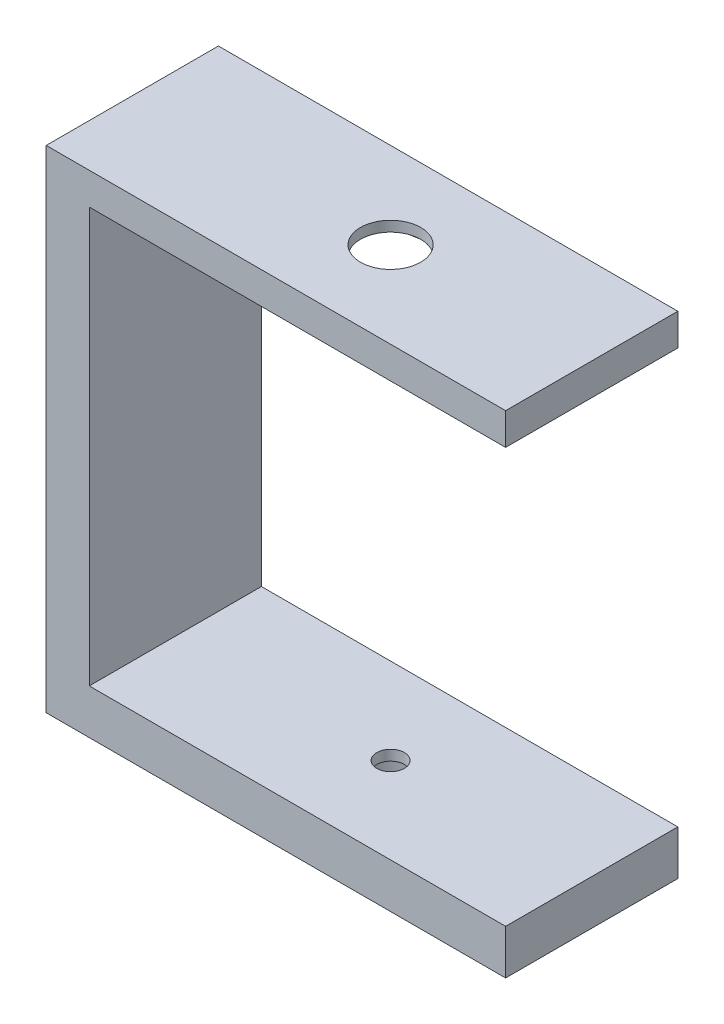
ISO-10303-21;
HEADER;
FILE_DESCRIPTION(('STEP AP214'),'2;1');
FILE_NAME('part.step','',(''),(''),'','','');
FILE_SCHEMA(('AUTOMOTIVE_DESIGN { 1 0 10303 214 1 1 1 1 }'));
ENDSEC;
DATA;
#1=APPLICATION_CONTEXT('core data for automotive mechanical design processes');
#2=APPLICATION_PROTOCOL_DEFINITION('international standard','automotive_design',2000,#1);
#3=PRODUCT_CONTEXT('',#1,'mechanical');
#4=PRODUCT('Part','Part','',(#3));
#5=PRODUCT_RELATED_PRODUCT_CATEGORY('part','',(#4));
#6=PRODUCT_DEFINITION_FORMATION('','',#4);
#7=PRODUCT_DEFINITION_CONTEXT('part definition',#1,'design');
#8=PRODUCT_DEFINITION('design','',#6,#7);
#9=PRODUCT_DEFINITION_SHAPE('','',#8);
#10=(LENGTH_UNIT() NAMED_UNIT(*) SI_UNIT(.MILLI.,.METRE.));
#11=(NAMED_UNIT(*) PLANE_ANGLE_UNIT() SI_UNIT($,.RADIAN.));
#12=(NAMED_UNIT(*) SI_UNIT($,.STERADIAN.) SOLID_ANGLE_UNIT());
#13=UNCERTAINTY_MEASURE_WITH_UNIT(LENGTH_MEASURE(1.E-05),#10,'distance_accuracy_value','');
#14=(GEOMETRIC_REPRESENTATION_CONTEXT(3) GLOBAL_UNCERTAINTY_ASSIGNED_CONTEXT((#13)) GLOBAL_UNIT_ASSIGNED_CONTEXT((#10,
#11,#12)) REPRESENTATION_CONTEXT('',''));
#15=CARTESIAN_POINT('',(0.,0.,0.));
#16=DIRECTION('',(0.,0.,1.));
#17=DIRECTION('',(1.,0.,0.));
#18=AXIS2_PLACEMENT_3D('',#15,#16,#17);
#19=CARTESIAN_POINT('',(0.,0.,0.));
#20=DIRECTION('',(0.,-1.,0.));
#21=DIRECTION('',(0.,0.,-1.));
#22=AXIS2_PLACEMENT_3D('',#19,#20,#21);
#23=PLANE('',#22);
#24=DIRECTION('',(0.,0.,1.));
#25=VECTOR('',#24,1.);
#26=CARTESIAN_POINT('',(5.,0.,0.));
#27=LINE('',#26,#25);
#28=CARTESIAN_POINT('',(5.,0.,-20.));
#29=VERTEX_POINT('',#28);
#30=CARTESIAN_POINT('',(5.,0.,0.));
#31=VERTEX_POINT('',#30);
#32=EDGE_CURVE('E59',#29,#31,#27,.T.);
#33=ORIENTED_EDGE('',*,*,#32,.F.);
#34=DIRECTION('',(-1.,0.,0.));
#35=VECTOR('',#34,1.);
#36=CARTESIAN_POINT('',(0.,0.,-20.));
#37=LINE('',#36,#35);
#38=CARTESIAN_POINT('',(53.36,0.,-20.));
#39=VERTEX_POINT('',#38);
#40=EDGE_CURVE('E249',#39,#29,#37,.T.);
#41=ORIENTED_EDGE('',*,*,#40,.F.);
#42=DIRECTION('',(0.,0.,-1.));
#43=VECTOR('',#42,1.);
#44=CARTESIAN_POINT('',(53.36,0.,0.));
#45=LINE('',#44,#43);
#46=CARTESIAN_POINT('',(53.36,0.,0.));
#47=VERTEX_POINT('',#46);
#48=EDGE_CURVE('E257',#47,#39,#45,.T.);
#49=ORIENTED_EDGE('',*,*,#48,.F.);
#50=DIRECTION('',(1.,0.,0.));
#51=VECTOR('',#50,1.);
#52=CARTESIAN_POINT('',(0.,0.,0.));
#53=LINE('',#52,#51);
#54=EDGE_CURVE('E244',#31,#47,#53,.T.);
#55=ORIENTED_EDGE('',*,*,#54,.F.);
#56=EDGE_LOOP('',(#33,#41,#49,#55));
#57=FACE_BOUND('',#56,.T.);
#58=CARTESIAN_POINT('',(30.,0.,-10.));
#59=DIRECTION('',(0.,-1.,0.));
#60=DIRECTION('',(0.,0.,-1.));
#61=AXIS2_PLACEMENT_3D('',#58,#59,#60);
#62=CIRCLE('',#61,6.34999999999999);
#63=CARTESIAN_POINT('',(31.1026659281849,0.,-3.74647076837246));
#64=VERTEX_POINT('',#63);
#65=CARTESIAN_POINT('',(28.897334071815,0.,-3.74647076837248));
#66=VERTEX_POINT('',#65);
#67=EDGE_CURVE('E51',#64,#66,#62,.T.);
#68=ORIENTED_EDGE('',*,*,#67,.F.);
#69=DIRECTION('',(0.984807753012212,0.,-0.17364817766691));
#70=VECTOR('',#69,1.);
#71=CARTESIAN_POINT('',(31.1026659281849,0.,-3.74647076837246));
#72=LINE('',#71,#70);
#73=CARTESIAN_POINT('',(46.1605720476516,0.,-6.40158589020922));
#74=VERTEX_POINT('',#73);
#75=EDGE_CURVE('E172',#64,#74,#72,.T.);
#76=ORIENTED_EDGE('',*,*,#75,.T.);
#77=CARTESIAN_POINT('',(45.5260745523336,0.,-9.99999999999979));
#78=DIRECTION('',(0.,1.,0.));
#79=DIRECTION('',(0.,0.,1.));
#80=AXIS2_PLACEMENT_3D('',#77,#78,#79);
#81=CIRCLE('',#80,3.65392544766649);
#82=CARTESIAN_POINT('',(46.1605720476517,0.,-13.5984141097903));
#83=VERTEX_POINT('',#82);
#84=EDGE_CURVE('E529',#74,#83,#81,.T.);
#85=ORIENTED_EDGE('',*,*,#84,.T.);
#86=DIRECTION('',(-0.984807753012207,0.,-0.173648177666937));
#87=VECTOR('',#86,1.);
#88=CARTESIAN_POINT('',(31.1026659281851,0.,-16.2535292316275));
#89=LINE('',#88,#87);
#90=CARTESIAN_POINT('',(31.1026659281851,0.,-16.2535292316275));
#91=VERTEX_POINT('',#90);
#92=EDGE_CURVE('E524',#83,#91,#89,.T.);
#93=ORIENTED_EDGE('',*,*,#92,.T.);
#94=CARTESIAN_POINT('',(30.,0.,-10.));
#95=DIRECTION('',(0.,-1.,0.));
#96=DIRECTION('',(0.,0.,-1.));
#97=AXIS2_PLACEMENT_3D('',#94,#95,#96);
#98=CIRCLE('',#97,6.34999999999999);
#99=CARTESIAN_POINT('',(28.897334071815,0.,-16.2535292316275));
#100=VERTEX_POINT('',#99);
#101=EDGE_CURVE('E176',#100,#91,#98,.T.);
#102=ORIENTED_EDGE('',*,*,#101,.F.);
#103=DIRECTION('',(0.984807753012209,0.,-0.173648177666923));
#104=VECTOR('',#103,1.);
#105=CARTESIAN_POINT('',(28.897334071815,0.,-16.2535292316275));
#106=LINE('',#105,#104);
#107=CARTESIAN_POINT('',(13.8394279523484,0.,-13.5984141097906));
#108=VERTEX_POINT('',#107);
#109=EDGE_CURVE('E200',#108,#100,#106,.T.);
#110=ORIENTED_EDGE('',*,*,#109,.F.);
#111=CARTESIAN_POINT('',(14.4739254476665,0.,-10.));
#112=DIRECTION('',(0.,-1.,0.));
#113=DIRECTION('',(0.,0.,1.));
#114=AXIS2_PLACEMENT_3D('',#111,#112,#113);
#115=CIRCLE('',#114,3.65392544766649);
#116=CARTESIAN_POINT('',(13.8394279523484,0.,-6.40158589020944));
#117=VERTEX_POINT('',#116);
#118=EDGE_CURVE('E197',#117,#108,#115,.T.);
#119=ORIENTED_EDGE('',*,*,#118,.F.);
#120=DIRECTION('',(-0.984807753012209,0.,-0.173648177666923));
#121=VECTOR('',#120,1.);
#122=CARTESIAN_POINT('',(28.897334071815,0.,-3.74647076837248));
#123=LINE('',#122,#121);
#124=EDGE_CURVE('E193',#66,#117,#123,.T.);
#125=ORIENTED_EDGE('',*,*,#124,.F.);
#126=EDGE_LOOP('',(#68,#76,#85,#93,#102,#110,#119,#125));
#127=FACE_BOUND('',#126,.T.);
#128=ADVANCED_FACE('F36',(#57,#127),#23,.T.);
#129=CARTESIAN_POINT('',(0.,3.7,0.));
#130=DIRECTION('',(1.,0.,0.));
#131=DIRECTION('',(0.,0.,-1.));
#132=AXIS2_PLACEMENT_3D('',#129,#130,#131);
#133=PLANE('',#132);
#134=DIRECTION('',(0.,-1.,0.));
#135=VECTOR('',#134,1.);
#136=CARTESIAN_POINT('',(0.,3.7,-20.));
#137=LINE('',#136,#135);
#138=CARTESIAN_POINT('',(0.,3.7,-20.));
#139=VERTEX_POINT('',#138);
#140=CARTESIAN_POINT('',(0.,-53.37,-20.));
#141=VERTEX_POINT('',#140);
#142=EDGE_CURVE('E255',#139,#141,#137,.T.);
#143=ORIENTED_EDGE('',*,*,#142,.T.);
#144=DIRECTION('',(0.,0.,-1.));
#145=VECTOR('',#144,1.);
#146=CARTESIAN_POINT('',(0.,-53.37,0.));
#147=LINE('',#146,#145);
#148=CARTESIAN_POINT('',(0.,-53.37,0.));
#149=VERTEX_POINT('',#148);
#150=EDGE_CURVE('E215',#149,#141,#147,.T.);
#151=ORIENTED_EDGE('',*,*,#150,.F.);
#152=DIRECTION('',(0.,-1.,0.));
#153=VECTOR('',#152,1.);
#154=CARTESIAN_POINT('',(0.,3.7,0.));
#155=LINE('',#154,#153);
#156=CARTESIAN_POINT('',(0.,3.7,0.));
#157=VERTEX_POINT('',#156);
#158=EDGE_CURVE('E11',#157,#149,#155,.T.);
#159=ORIENTED_EDGE('',*,*,#158,.F.);
#160=DIRECTION('',(0.,0.,1.));
#161=VECTOR('',#160,1.);
#162=CARTESIAN_POINT('',(0.,3.7,0.));
#163=LINE('',#162,#161);
#164=EDGE_CURVE('E245',#139,#157,#163,.T.);
#165=ORIENTED_EDGE('',*,*,#164,.F.);
#166=EDGE_LOOP('',(#143,#151,#159,#165));
#167=FACE_BOUND('',#166,.T.);
#168=ADVANCED_FACE('F38',(#167),#133,.F.);
#169=CARTESIAN_POINT('',(0.,3.7,0.));
#170=DIRECTION('',(0.,0.,-1.));
#171=DIRECTION('',(-1.,0.,0.));
#172=AXIS2_PLACEMENT_3D('',#169,#170,#171);
#173=PLANE('',#172);
#174=ORIENTED_EDGE('',*,*,#158,.T.);
#175=DIRECTION('',(-1.,0.,0.));
#176=VECTOR('',#175,1.);
#177=CARTESIAN_POINT('',(0.,-53.37,0.));
#178=LINE('',#177,#176);
#179=CARTESIAN_POINT('',(53.36,-53.37,0.));
#180=VERTEX_POINT('',#179);
#181=EDGE_CURVE('E212',#180,#149,#178,.T.);
#182=ORIENTED_EDGE('',*,*,#181,.F.);
#183=DIRECTION('',(0.,1.,0.));
#184=VECTOR('',#183,1.);
#185=CARTESIAN_POINT('',(53.36,-53.37,0.));
#186=LINE('',#185,#184);
#187=CARTESIAN_POINT('',(53.36,-48.17,0.));
#188=VERTEX_POINT('',#187);
#189=EDGE_CURVE('E223',#180,#188,#186,.T.);
#190=ORIENTED_EDGE('',*,*,#189,.T.);
#191=DIRECTION('',(-1.,0.,0.));
#192=VECTOR('',#191,1.);
#193=CARTESIAN_POINT('',(0.,-48.17,0.));
#194=LINE('',#193,#192);
#195=CARTESIAN_POINT('',(5.,-48.17,0.));
#196=VERTEX_POINT('',#195);
#197=EDGE_CURVE('E206',#188,#196,#194,.T.);
#198=ORIENTED_EDGE('',*,*,#197,.T.);
#199=DIRECTION('',(0.,1.,0.));
#200=VECTOR('',#199,1.);
#201=CARTESIAN_POINT('',(5.,-48.17,0.));
#202=LINE('',#201,#200);
#203=EDGE_CURVE('E237',#196,#31,#202,.T.);
#204=ORIENTED_EDGE('',*,*,#203,.T.);
#205=ORIENTED_EDGE('',*,*,#54,.T.);
#206=DIRECTION('',(0.,-1.,0.));
#207=VECTOR('',#206,1.);
#208=CARTESIAN_POINT('',(53.36,3.7,0.));
#209=LINE('',#208,#207);
#210=CARTESIAN_POINT('',(53.36,3.7,0.));
#211=VERTEX_POINT('',#210);
#212=EDGE_CURVE('E44',#211,#47,#209,.T.);
#213=ORIENTED_EDGE('',*,*,#212,.F.);
#214=DIRECTION('',(1.,0.,0.));
#215=VECTOR('',#214,1.);
#216=CARTESIAN_POINT('',(0.,3.7,0.));
#217=LINE('',#216,#215);
#218=EDGE_CURVE('E248',#157,#211,#217,.T.);
#219=ORIENTED_EDGE('',*,*,#218,.F.);
#220=EDGE_LOOP('',(#174,#182,#190,#198,#204,#205,#213,#219));
#221=FACE_BOUND('',#220,.T.);
#222=ADVANCED_FACE('F283',(#221),#173,.F.);
#223=CARTESIAN_POINT('',(53.36,3.7,0.));
#224=DIRECTION('',(-1.,0.,0.));
#225=DIRECTION('',(0.,0.,1.));
#226=AXIS2_PLACEMENT_3D('',#223,#224,#225);
#227=PLANE('',#226);
#228=ORIENTED_EDGE('',*,*,#48,.T.);
#229=DIRECTION('',(0.,-1.,0.));
#230=VECTOR('',#229,1.);
#231=CARTESIAN_POINT('',(53.36,3.7,-20.));
#232=LINE('',#231,#230);
#233=CARTESIAN_POINT('',(53.36,3.7,-20.));
#234=VERTEX_POINT('',#233);
#235=EDGE_CURVE('E261',#234,#39,#232,.T.);
#236=ORIENTED_EDGE('',*,*,#235,.F.);
#237=DIRECTION('',(0.,0.,-1.));
#238=VECTOR('',#237,1.);
#239=CARTESIAN_POINT('',(53.36,3.7,0.));
#240=LINE('',#239,#238);
#241=EDGE_CURVE('E251',#211,#234,#240,.T.);
#242=ORIENTED_EDGE('',*,*,#241,.F.);
#243=ORIENTED_EDGE('',*,*,#212,.T.);
#244=EDGE_LOOP('',(#228,#236,#242,#243));
#245=FACE_BOUND('',#244,.T.);
#246=ADVANCED_FACE('F268',(#245),#227,.F.);
#247=CARTESIAN_POINT('',(0.,3.7,-20.));
#248=DIRECTION('',(0.,0.,1.));
#249=DIRECTION('',(1.,0.,0.));
#250=AXIS2_PLACEMENT_3D('',#247,#248,#249);
#251=PLANE('',#250);
#252=ORIENTED_EDGE('',*,*,#40,.T.);
#253=DIRECTION('',(0.,1.,0.));
#254=VECTOR('',#253,1.);
#255=CARTESIAN_POINT('',(5.,-48.17,-20.));
#256=LINE('',#255,#254);
#257=CARTESIAN_POINT('',(5.,-48.17,-20.));
#258=VERTEX_POINT('',#257);
#259=EDGE_CURVE('E241',#258,#29,#256,.T.);
#260=ORIENTED_EDGE('',*,*,#259,.F.);
#261=DIRECTION('',(1.,0.,0.));
#262=VECTOR('',#261,1.);
#263=CARTESIAN_POINT('',(53.36,-48.17,-20.));
#264=LINE('',#263,#262);
#265=CARTESIAN_POINT('',(53.36,-48.17,-20.));
#266=VERTEX_POINT('',#265);
#267=EDGE_CURVE('E226',#258,#266,#264,.T.);
#268=ORIENTED_EDGE('',*,*,#267,.T.);
#269=DIRECTION('',(0.,1.,0.));
#270=VECTOR('',#269,1.);
#271=CARTESIAN_POINT('',(53.36,-53.37,-20.));
#272=LINE('',#271,#270);
#273=CARTESIAN_POINT('',(53.36,-53.37,-20.));
#274=VERTEX_POINT('',#273);
#275=EDGE_CURVE('E231',#274,#266,#272,.T.);
#276=ORIENTED_EDGE('',*,*,#275,.F.);
#277=DIRECTION('',(1.,0.,0.));
#278=VECTOR('',#277,1.);
#279=CARTESIAN_POINT('',(53.36,-53.37,-20.));
#280=LINE('',#279,#278);
#281=EDGE_CURVE('E219',#141,#274,#280,.T.);
#282=ORIENTED_EDGE('',*,*,#281,.F.);
#283=ORIENTED_EDGE('',*,*,#142,.F.);
#284=DIRECTION('',(-1.,0.,0.));
#285=VECTOR('',#284,1.);
#286=CARTESIAN_POINT('',(0.,3.7,-20.));
#287=LINE('',#286,#285);
#288=EDGE_CURVE('E253',#234,#139,#287,.T.);
#289=ORIENTED_EDGE('',*,*,#288,.F.);
#290=ORIENTED_EDGE('',*,*,#235,.T.);
#291=EDGE_LOOP('',(#252,#260,#268,#276,#282,#283,#289,#290));
#292=FACE_BOUND('',#291,.T.);
#293=ADVANCED_FACE('F274',(#292),#251,.F.);
#294=CARTESIAN_POINT('',(0.,3.7,0.));
#295=DIRECTION('',(0.,-1.,0.));
#296=DIRECTION('',(0.,0.,-1.));
#297=AXIS2_PLACEMENT_3D('',#294,#295,#296);
#298=PLANE('',#297);
#299=CARTESIAN_POINT('',(30.,3.7,-10.));
#300=DIRECTION('',(0.,-1.,0.));
#301=DIRECTION('',(0.,0.,-1.));
#302=AXIS2_PLACEMENT_3D('',#299,#300,#301);
#303=CIRCLE('',#302,3.5);
#304=CARTESIAN_POINT('',(30.,3.7,-13.5));
#305=VERTEX_POINT('',#304);
#306=EDGE_CURVE('E522',#305,#305,#303,.T.);
#307=ORIENTED_EDGE('',*,*,#306,.T.);
#308=EDGE_LOOP('',(#307));
#309=FACE_BOUND('',#308,.T.);
#310=ORIENTED_EDGE('',*,*,#164,.T.);
#311=ORIENTED_EDGE('',*,*,#218,.T.);
#312=ORIENTED_EDGE('',*,*,#241,.T.);
#313=ORIENTED_EDGE('',*,*,#288,.T.);
#314=EDGE_LOOP('',(#310,#311,#312,#313));
#315=FACE_BOUND('',#314,.T.);
#316=ADVANCED_FACE('F299',(#309,#315),#298,.F.);
#317=CARTESIAN_POINT('',(5.,-48.17,0.));
#318=DIRECTION('',(-1.,0.,0.));
#319=DIRECTION('',(0.,0.,1.));
#320=AXIS2_PLACEMENT_3D('',#317,#318,#319);
#321=PLANE('',#320);
#322=ORIENTED_EDGE('',*,*,#32,.T.);
#323=ORIENTED_EDGE('',*,*,#203,.F.);
#324=DIRECTION('',(0.,0.,1.));
#325=VECTOR('',#324,1.);
#326=CARTESIAN_POINT('',(5.,-48.17,0.));
#327=LINE('',#326,#325);
#328=EDGE_CURVE('E234',#258,#196,#327,.T.);
#329=ORIENTED_EDGE('',*,*,#328,.F.);
#330=ORIENTED_EDGE('',*,*,#259,.T.);
#331=EDGE_LOOP('',(#322,#323,#329,#330));
#332=FACE_BOUND('',#331,.T.);
#333=ADVANCED_FACE('F278',(#332),#321,.F.);
#334=CARTESIAN_POINT('',(53.36,-53.37,0.));
#335=DIRECTION('',(-1.,0.,0.));
#336=DIRECTION('',(0.,0.,1.));
#337=AXIS2_PLACEMENT_3D('',#334,#335,#336);
#338=PLANE('',#337);
#339=DIRECTION('',(0.,0.,1.));
#340=VECTOR('',#339,1.);
#341=CARTESIAN_POINT('',(53.36,-48.17,0.));
#342=LINE('',#341,#340);
#343=EDGE_CURVE('E216',#266,#188,#342,.T.);
#344=ORIENTED_EDGE('',*,*,#343,.T.);
#345=ORIENTED_EDGE('',*,*,#189,.F.);
#346=DIRECTION('',(0.,0.,1.));
#347=VECTOR('',#346,1.);
#348=CARTESIAN_POINT('',(53.36,-53.37,0.));
#349=LINE('',#348,#347);
#350=EDGE_CURVE('E221',#274,#180,#349,.T.);
#351=ORIENTED_EDGE('',*,*,#350,.F.);
#352=ORIENTED_EDGE('',*,*,#275,.T.);
#353=EDGE_LOOP('',(#344,#345,#351,#352));
#354=FACE_BOUND('',#353,.T.);
#355=ADVANCED_FACE('F288',(#354),#338,.F.);
#356=CARTESIAN_POINT('',(0.,-53.37,0.));
#357=DIRECTION('',(0.,1.,0.));
#358=DIRECTION('',(0.,0.,1.));
#359=AXIS2_PLACEMENT_3D('',#356,#357,#358);
#360=PLANE('',#359);
#361=CARTESIAN_POINT('',(30.,-53.37,-10.));
#362=DIRECTION('',(0.,-1.,0.));
#363=DIRECTION('',(0.,0.,-1.));
#364=AXIS2_PLACEMENT_3D('',#361,#362,#363);
#365=CIRCLE('',#364,5.);
#366=CARTESIAN_POINT('',(30.,-53.37,-15.));
#367=VERTEX_POINT('',#366);
#368=EDGE_CURVE('E513',#367,#367,#365,.T.);
#369=ORIENTED_EDGE('',*,*,#368,.F.);
#370=EDGE_LOOP('',(#369));
#371=FACE_BOUND('',#370,.T.);
#372=ORIENTED_EDGE('',*,*,#181,.T.);
#373=ORIENTED_EDGE('',*,*,#150,.T.);
#374=ORIENTED_EDGE('',*,*,#281,.T.);
#375=ORIENTED_EDGE('',*,*,#350,.T.);
#376=EDGE_LOOP('',(#372,#373,#374,#375));
#377=FACE_BOUND('',#376,.T.);
#378=ADVANCED_FACE('F294',(#371,#377),#360,.F.);
#379=CARTESIAN_POINT('',(0.,-48.17,0.));
#380=DIRECTION('',(0.,1.,0.));
#381=DIRECTION('',(0.,0.,1.));
#382=AXIS2_PLACEMENT_3D('',#379,#380,#381);
#383=PLANE('',#382);
#384=CARTESIAN_POINT('',(30.,-48.17,-10.));
#385=DIRECTION('',(0.,1.,0.));
#386=DIRECTION('',(0.,0.,1.));
#387=AXIS2_PLACEMENT_3D('',#384,#385,#386);
#388=CIRCLE('',#387,1.6);
#389=CARTESIAN_POINT('',(30.,-48.17,-11.6));
#390=VERTEX_POINT('',#389);
#391=EDGE_CURVE('E508',#390,#390,#388,.T.);
#392=ORIENTED_EDGE('',*,*,#391,.F.);
#393=EDGE_LOOP('',(#392));
#394=FACE_BOUND('',#393,.T.);
#395=ORIENTED_EDGE('',*,*,#267,.F.);
#396=ORIENTED_EDGE('',*,*,#328,.T.);
#397=ORIENTED_EDGE('',*,*,#197,.F.);
#398=ORIENTED_EDGE('',*,*,#343,.F.);
#399=EDGE_LOOP('',(#395,#396,#397,#398));
#400=FACE_BOUND('',#399,.T.);
#401=ADVANCED_FACE('F281',(#394,#400),#383,.T.);
#402=CARTESIAN_POINT('',(30.,2.5,-10.));
#403=DIRECTION('',(0.,-1.,0.));
#404=DIRECTION('',(0.,0.,-1.));
#405=AXIS2_PLACEMENT_3D('',#402,#403,#404);
#406=CYLINDRICAL_SURFACE('',#405,6.34999999999999);
#407=ORIENTED_EDGE('',*,*,#67,.T.);
#408=DIRECTION('',(0.,-1.,0.));
#409=VECTOR('',#408,1.);
#410=CARTESIAN_POINT('',(28.897334071815,2.5,-3.74647076837248));
#411=LINE('',#410,#409);
#412=CARTESIAN_POINT('',(28.897334071815,2.5,-3.74647076837248));
#413=VERTEX_POINT('',#412);
#414=EDGE_CURVE('E161',#413,#66,#411,.T.);
#415=ORIENTED_EDGE('',*,*,#414,.F.);
#416=CARTESIAN_POINT('',(30.,2.5,-10.));
#417=DIRECTION('',(0.,-1.,0.));
#418=DIRECTION('',(0.,0.,-1.));
#419=AXIS2_PLACEMENT_3D('',#416,#417,#418);
#420=CIRCLE('',#419,6.34999999999999);
#421=CARTESIAN_POINT('',(31.1026659281849,2.5,-3.74647076837246));
#422=VERTEX_POINT('',#421);
#423=EDGE_CURVE('E184',#422,#413,#420,.T.);
#424=ORIENTED_EDGE('',*,*,#423,.F.);
#425=DIRECTION('',(0.,-1.,0.));
#426=VECTOR('',#425,1.);
#427=CARTESIAN_POINT('',(31.1026659281849,2.5,-3.74647076837246));
#428=LINE('',#427,#426);
#429=EDGE_CURVE('E194',#422,#64,#428,.T.);
#430=ORIENTED_EDGE('',*,*,#429,.T.);
#431=EDGE_LOOP('',(#407,#415,#424,#430));
#432=FACE_BOUND('',#431,.T.);
#433=ADVANCED_FACE('F392',(#432),#406,.F.);
#434=CARTESIAN_POINT('',(30.,2.5,-10.));
#435=DIRECTION('',(0.,-1.,0.));
#436=DIRECTION('',(0.,0.,-1.));
#437=AXIS2_PLACEMENT_3D('',#434,#435,#436);
#438=CYLINDRICAL_SURFACE('',#437,6.34999999999999);
#439=ORIENTED_EDGE('',*,*,#101,.T.);
#440=DIRECTION('',(0.,-1.,0.));
#441=VECTOR('',#440,1.);
#442=CARTESIAN_POINT('',(31.1026659281851,2.5,-16.2535292316275));
#443=LINE('',#442,#441);
#444=CARTESIAN_POINT('',(31.1026659281851,2.5,-16.2535292316275));
#445=VERTEX_POINT('',#444);
#446=EDGE_CURVE('E168',#445,#91,#443,.T.);
#447=ORIENTED_EDGE('',*,*,#446,.F.);
#448=CARTESIAN_POINT('',(30.,2.5,-10.));
#449=DIRECTION('',(0.,-1.,0.));
#450=DIRECTION('',(0.,0.,-1.));
#451=AXIS2_PLACEMENT_3D('',#448,#449,#450);
#452=CIRCLE('',#451,6.34999999999999);
#453=CARTESIAN_POINT('',(28.897334071815,2.5,-16.2535292316275));
#454=VERTEX_POINT('',#453);
#455=EDGE_CURVE('E150',#454,#445,#452,.T.);
#456=ORIENTED_EDGE('',*,*,#455,.F.);
#457=DIRECTION('',(0.,-1.,0.));
#458=VECTOR('',#457,1.);
#459=CARTESIAN_POINT('',(28.897334071815,2.5,-16.2535292316275));
#460=LINE('',#459,#458);
#461=EDGE_CURVE('E204',#454,#100,#460,.T.);
#462=ORIENTED_EDGE('',*,*,#461,.T.);
#463=EDGE_LOOP('',(#439,#447,#456,#462));
#464=FACE_BOUND('',#463,.T.);
#465=ADVANCED_FACE('F174',(#464),#438,.F.);
#466=CARTESIAN_POINT('',(28.897334071815,2.5,-16.2535292316275));
#467=DIRECTION('',(-0.173648177666923,0.,-0.984807753012209));
#468=DIRECTION('',(-0.984807753012209,0.,0.173648177666923));
#469=AXIS2_PLACEMENT_3D('',#466,#467,#468);
#470=PLANE('',#469);
#471=ORIENTED_EDGE('',*,*,#109,.T.);
#472=ORIENTED_EDGE('',*,*,#461,.F.);
#473=DIRECTION('',(0.984807753012209,0.,-0.173648177666923));
#474=VECTOR('',#473,1.);
#475=CARTESIAN_POINT('',(28.897334071815,2.5,-16.2535292316275));
#476=LINE('',#475,#474);
#477=CARTESIAN_POINT('',(13.8394279523484,2.5,-13.5984141097906));
#478=VERTEX_POINT('',#477);
#479=EDGE_CURVE('E158',#478,#454,#476,.T.);
#480=ORIENTED_EDGE('',*,*,#479,.F.);
#481=DIRECTION('',(0.,-1.,0.));
#482=VECTOR('',#481,1.);
#483=CARTESIAN_POINT('',(13.8394279523484,2.5,-13.5984141097906));
#484=LINE('',#483,#482);
#485=EDGE_CURVE('E207',#478,#108,#484,.T.);
#486=ORIENTED_EDGE('',*,*,#485,.T.);
#487=EDGE_LOOP('',(#471,#472,#480,#486));
#488=FACE_BOUND('',#487,.T.);
#489=ADVANCED_FACE('F353',(#488),#470,.F.);
#490=CARTESIAN_POINT('',(14.4739254476665,2.5,-10.));
#491=DIRECTION('',(0.,-1.,0.));
#492=DIRECTION('',(0.,0.,-1.));
#493=AXIS2_PLACEMENT_3D('',#490,#491,#492);
#494=CYLINDRICAL_SURFACE('',#493,3.65392544766649);
#495=ORIENTED_EDGE('',*,*,#118,.T.);
#496=ORIENTED_EDGE('',*,*,#485,.F.);
#497=CARTESIAN_POINT('',(14.4739254476665,2.5,-10.));
#498=DIRECTION('',(0.,-1.,0.));
#499=DIRECTION('',(0.,0.,1.));
#500=AXIS2_PLACEMENT_3D('',#497,#498,#499);
#501=CIRCLE('',#500,3.65392544766649);
#502=CARTESIAN_POINT('',(13.8394279523484,2.5,-6.40158589020944));
#503=VERTEX_POINT('',#502);
#504=EDGE_CURVE('E189',#503,#478,#501,.T.);
#505=ORIENTED_EDGE('',*,*,#504,.F.);
#506=DIRECTION('',(0.,-1.,0.));
#507=VECTOR('',#506,1.);
#508=CARTESIAN_POINT('',(13.8394279523484,2.5,-6.40158589020944));
#509=LINE('',#508,#507);
#510=EDGE_CURVE('E209',#503,#117,#509,.T.);
#511=ORIENTED_EDGE('',*,*,#510,.T.);
#512=EDGE_LOOP('',(#495,#496,#505,#511));
#513=FACE_BOUND('',#512,.T.);
#514=ADVANCED_FACE('F358',(#513),#494,.F.);
#515=CARTESIAN_POINT('',(28.897334071815,2.5,-3.74647076837248));
#516=DIRECTION('',(-0.173648177666923,0.,0.984807753012209));
#517=DIRECTION('',(0.984807753012209,0.,0.173648177666923));
#518=AXIS2_PLACEMENT_3D('',#515,#516,#517);
#519=PLANE('',#518);
#520=ORIENTED_EDGE('',*,*,#124,.T.);
#521=ORIENTED_EDGE('',*,*,#510,.F.);
#522=DIRECTION('',(-0.984807753012209,0.,-0.173648177666923));
#523=VECTOR('',#522,1.);
#524=CARTESIAN_POINT('',(28.897334071815,2.5,-3.74647076837248));
#525=LINE('',#524,#523);
#526=EDGE_CURVE('E186',#413,#503,#525,.T.);
#527=ORIENTED_EDGE('',*,*,#526,.F.);
#528=ORIENTED_EDGE('',*,*,#414,.T.);
#529=EDGE_LOOP('',(#520,#521,#527,#528));
#530=FACE_BOUND('',#529,.T.);
#531=ADVANCED_FACE('F370',(#530),#519,.F.);
#532=CARTESIAN_POINT('',(30.,2.5,-10.));
#533=DIRECTION('',(0.,-1.,0.));
#534=DIRECTION('',(0.,0.,-1.));
#535=AXIS2_PLACEMENT_3D('',#532,#533,#534);
#536=PLANE('',#535);
#537=CARTESIAN_POINT('',(30.,2.5,-10.));
#538=DIRECTION('',(0.,-1.,0.));
#539=DIRECTION('',(0.,0.,-1.));
#540=AXIS2_PLACEMENT_3D('',#537,#538,#539);
#541=CIRCLE('',#540,3.5);
#542=CARTESIAN_POINT('',(30.,2.5,-13.5));
#543=VERTEX_POINT('',#542);
#544=EDGE_CURVE('E519',#543,#543,#541,.T.);
#545=ORIENTED_EDGE('',*,*,#544,.F.);
#546=EDGE_LOOP('',(#545));
#547=FACE_BOUND('',#546,.T.);
#548=ORIENTED_EDGE('',*,*,#423,.T.);
#549=ORIENTED_EDGE('',*,*,#526,.T.);
#550=ORIENTED_EDGE('',*,*,#504,.T.);
#551=ORIENTED_EDGE('',*,*,#479,.T.);
#552=ORIENTED_EDGE('',*,*,#455,.T.);
#553=DIRECTION('',(-0.984807753012207,0.,-0.173648177666937));
#554=VECTOR('',#553,1.);
#555=CARTESIAN_POINT('',(31.1026659281851,2.5,-16.2535292316275));
#556=LINE('',#555,#554);
#557=CARTESIAN_POINT('',(46.1605720476517,2.5,-13.5984141097903));
#558=VERTEX_POINT('',#557);
#559=EDGE_CURVE('E155',#558,#445,#556,.T.);
#560=ORIENTED_EDGE('',*,*,#559,.F.);
#561=CARTESIAN_POINT('',(45.5260745523336,2.5,-9.99999999999979));
#562=DIRECTION('',(0.,1.,0.));
#563=DIRECTION('',(0.,0.,1.));
#564=AXIS2_PLACEMENT_3D('',#561,#562,#563);
#565=CIRCLE('',#564,3.65392544766649);
#566=CARTESIAN_POINT('',(46.1605720476516,2.5,-6.40158589020922));
#567=VERTEX_POINT('',#566);
#568=EDGE_CURVE('E171',#567,#558,#565,.T.);
#569=ORIENTED_EDGE('',*,*,#568,.F.);
#570=DIRECTION('',(0.984807753012212,0.,-0.17364817766691));
#571=VECTOR('',#570,1.);
#572=CARTESIAN_POINT('',(31.1026659281849,2.5,-3.74647076837246));
#573=LINE('',#572,#571);
#574=EDGE_CURVE('E177',#422,#567,#573,.T.);
#575=ORIENTED_EDGE('',*,*,#574,.F.);
#576=EDGE_LOOP('',(#548,#549,#550,#551,#552,#560,#569,#575));
#577=FACE_BOUND('',#576,.T.);
#578=ADVANCED_FACE('F153',(#547,#577),#536,.T.);
#579=CARTESIAN_POINT('',(31.1026659281849,2.5,-3.74647076837246));
#580=DIRECTION('',(-0.17364817766691,0.,-0.984807753012212));
#581=DIRECTION('',(-0.984807753012212,0.,0.17364817766691));
#582=AXIS2_PLACEMENT_3D('',#579,#580,#581);
#583=PLANE('',#582);
#584=ORIENTED_EDGE('',*,*,#75,.F.);
#585=ORIENTED_EDGE('',*,*,#429,.F.);
#586=ORIENTED_EDGE('',*,*,#574,.T.);
#587=DIRECTION('',(0.,-1.,0.));
#588=VECTOR('',#587,1.);
#589=CARTESIAN_POINT('',(46.1605720476516,2.5,-6.40158589020922));
#590=LINE('',#589,#588);
#591=EDGE_CURVE('E179',#567,#74,#590,.T.);
#592=ORIENTED_EDGE('',*,*,#591,.T.);
#593=EDGE_LOOP('',(#584,#585,#586,#592));
#594=FACE_BOUND('',#593,.T.);
#595=ADVANCED_FACE('F410',(#594),#583,.T.);
#596=CARTESIAN_POINT('',(45.5260745523336,2.5,-9.99999999999979));
#597=DIRECTION('',(0.,-1.,0.));
#598=DIRECTION('',(0.,0.,-1.));
#599=AXIS2_PLACEMENT_3D('',#596,#597,#598);
#600=CYLINDRICAL_SURFACE('',#599,3.65392544766649);
#601=ORIENTED_EDGE('',*,*,#84,.F.);
#602=ORIENTED_EDGE('',*,*,#591,.F.);
#603=ORIENTED_EDGE('',*,*,#568,.T.);
#604=DIRECTION('',(0.,-1.,0.));
#605=VECTOR('',#604,1.);
#606=CARTESIAN_POINT('',(46.1605720476517,2.5,-13.5984141097903));
#607=LINE('',#606,#605);
#608=EDGE_CURVE('E170',#558,#83,#607,.T.);
#609=ORIENTED_EDGE('',*,*,#608,.T.);
#610=EDGE_LOOP('',(#601,#602,#603,#609));
#611=FACE_BOUND('',#610,.T.);
#612=ADVANCED_FACE('F415',(#611),#600,.F.);
#613=CARTESIAN_POINT('',(31.1026659281851,2.5,-16.2535292316275));
#614=DIRECTION('',(-0.173648177666937,0.,0.984807753012207));
#615=DIRECTION('',(0.984807753012207,0.,0.173648177666937));
#616=AXIS2_PLACEMENT_3D('',#613,#614,#615);
#617=PLANE('',#616);
#618=ORIENTED_EDGE('',*,*,#92,.F.);
#619=ORIENTED_EDGE('',*,*,#608,.F.);
#620=ORIENTED_EDGE('',*,*,#559,.T.);
#621=ORIENTED_EDGE('',*,*,#446,.T.);
#622=EDGE_LOOP('',(#618,#619,#620,#621));
#623=FACE_BOUND('',#622,.T.);
#624=ADVANCED_FACE('F167',(#623),#617,.T.);
#625=CARTESIAN_POINT('',(30.,3.7,-10.));
#626=DIRECTION('',(0.,-1.,0.));
#627=DIRECTION('',(0.,0.,-1.));
#628=AXIS2_PLACEMENT_3D('',#625,#626,#627);
#629=CYLINDRICAL_SURFACE('',#628,3.5);
#630=ORIENTED_EDGE('',*,*,#306,.F.);
#631=EDGE_LOOP('',(#630));
#632=FACE_BOUND('',#631,.T.);
#633=ORIENTED_EDGE('',*,*,#544,.T.);
#634=EDGE_LOOP('',(#633));
#635=FACE_BOUND('',#634,.T.);
#636=ADVANCED_FACE('F433',(#632,#635),#629,.F.);
#637=CARTESIAN_POINT('',(30.,-49.37,-10.));
#638=DIRECTION('',(0.,-1.,0.));
#639=DIRECTION('',(0.,0.,-1.));
#640=AXIS2_PLACEMENT_3D('',#637,#638,#639);
#641=CYLINDRICAL_SURFACE('',#640,5.);
#642=CARTESIAN_POINT('',(30.,-49.37,-10.));
#643=DIRECTION('',(0.,-1.,0.));
#644=DIRECTION('',(0.,0.,-1.));
#645=AXIS2_PLACEMENT_3D('',#642,#643,#644);
#646=CIRCLE('',#645,5.);
#647=CARTESIAN_POINT('',(30.,-49.37,-15.));
#648=VERTEX_POINT('',#647);
#649=EDGE_CURVE('E516',#648,#648,#646,.T.);
#650=ORIENTED_EDGE('',*,*,#649,.F.);
#651=EDGE_LOOP('',(#650));
#652=FACE_BOUND('',#651,.T.);
#653=ORIENTED_EDGE('',*,*,#368,.T.);
#654=EDGE_LOOP('',(#653));
#655=FACE_BOUND('',#654,.T.);
#656=ADVANCED_FACE('F456',(#652,#655),#641,.F.);
#657=CARTESIAN_POINT('',(30.,-49.37,-10.));
#658=DIRECTION('',(0.,-1.,0.));
#659=DIRECTION('',(0.,0.,-1.));
#660=AXIS2_PLACEMENT_3D('',#657,#658,#659);
#661=PLANE('',#660);
#662=CARTESIAN_POINT('',(30.,-49.37,-10.));
#663=DIRECTION('',(0.,-1.,0.));
#664=DIRECTION('',(0.,0.,-1.));
#665=AXIS2_PLACEMENT_3D('',#662,#663,#664);
#666=CIRCLE('',#665,1.6);
#667=CARTESIAN_POINT('',(30.,-49.37,-11.6));
#668=VERTEX_POINT('',#667);
#669=EDGE_CURVE('E511',#668,#668,#666,.T.);
#670=ORIENTED_EDGE('',*,*,#669,.F.);
#671=EDGE_LOOP('',(#670));
#672=FACE_BOUND('',#671,.T.);
#673=ORIENTED_EDGE('',*,*,#649,.T.);
#674=EDGE_LOOP('',(#673));
#675=FACE_BOUND('',#674,.T.);
#676=ADVANCED_FACE('F474',(#672,#675),#661,.T.);
#677=CARTESIAN_POINT('',(30.,3.7,-10.));
#678=DIRECTION('',(0.,-1.,0.));
#679=DIRECTION('',(0.,0.,-1.));
#680=AXIS2_PLACEMENT_3D('',#677,#678,#679);
#681=CYLINDRICAL_SURFACE('',#680,1.6);
#682=CARTESIAN_POINT('',(30.,-48.17,-11.6));
#683=CARTESIAN_POINT('',(30.,-48.1825,-11.6));
#684=CARTESIAN_POINT('',(30.,-48.195,-11.6));
#685=CARTESIAN_POINT('',(30.,-48.22,-11.6));
#686=CARTESIAN_POINT('',(30.,-48.2325,-11.6));
#687=CARTESIAN_POINT('',(30.,-48.2575,-11.6));
#688=CARTESIAN_POINT('',(30.,-48.27,-11.6));
#689=CARTESIAN_POINT('',(30.,-48.295,-11.6));
#690=CARTESIAN_POINT('',(30.,-48.3075,-11.6));
#691=CARTESIAN_POINT('',(30.,-48.3325,-11.6));
#692=CARTESIAN_POINT('',(30.,-48.345,-11.6));
#693=CARTESIAN_POINT('',(30.,-48.37,-11.6));
#694=CARTESIAN_POINT('',(30.,-48.3825,-11.6));
#695=CARTESIAN_POINT('',(30.,-48.4075,-11.6));
#696=CARTESIAN_POINT('',(30.,-48.42,-11.6));
#697=CARTESIAN_POINT('',(30.,-48.445,-11.6));
#698=CARTESIAN_POINT('',(30.,-48.4575,-11.6));
#699=CARTESIAN_POINT('',(30.,-48.4825,-11.6));
#700=CARTESIAN_POINT('',(30.,-48.495,-11.6));
#701=CARTESIAN_POINT('',(30.,-48.52,-11.6));
#702=CARTESIAN_POINT('',(30.,-48.5325,-11.6));
#703=CARTESIAN_POINT('',(30.,-48.5575,-11.6));
#704=CARTESIAN_POINT('',(30.,-48.57,-11.6));
#705=CARTESIAN_POINT('',(30.,-48.595,-11.6));
#706=CARTESIAN_POINT('',(30.,-48.6075,-11.6));
#707=CARTESIAN_POINT('',(30.,-48.6325,-11.6));
#708=CARTESIAN_POINT('',(30.,-48.645,-11.6));
#709=CARTESIAN_POINT('',(30.,-48.67,-11.6));
#710=CARTESIAN_POINT('',(30.,-48.6825,-11.6));
#711=CARTESIAN_POINT('',(30.,-48.7075,-11.6));
#712=CARTESIAN_POINT('',(30.,-48.72,-11.6));
#713=CARTESIAN_POINT('',(30.,-48.745,-11.6));
#714=CARTESIAN_POINT('',(30.,-48.7575,-11.6));
#715=CARTESIAN_POINT('',(30.,-48.7825,-11.6));
#716=CARTESIAN_POINT('',(30.,-48.795,-11.6));
#717=CARTESIAN_POINT('',(30.,-48.82,-11.6));
#718=CARTESIAN_POINT('',(30.,-48.8325,-11.6));
#719=CARTESIAN_POINT('',(30.,-48.8575,-11.6));
#720=CARTESIAN_POINT('',(30.,-48.87,-11.6));
#721=CARTESIAN_POINT('',(30.,-48.895,-11.6));
#722=CARTESIAN_POINT('',(30.,-48.9075,-11.6));
#723=CARTESIAN_POINT('',(30.,-48.9325,-11.6));
#724=CARTESIAN_POINT('',(30.,-48.945,-11.6));
#725=CARTESIAN_POINT('',(30.,-48.97,-11.6));
#726=CARTESIAN_POINT('',(30.,-48.9825,-11.6));
#727=CARTESIAN_POINT('',(30.,-49.0075,-11.6));
#728=CARTESIAN_POINT('',(30.,-49.02,-11.6));
#729=CARTESIAN_POINT('',(30.,-49.045,-11.6));
#730=CARTESIAN_POINT('',(30.,-49.0575,-11.6));
#731=CARTESIAN_POINT('',(30.,-49.0825,-11.6));
#732=CARTESIAN_POINT('',(30.,-49.095,-11.6));
#733=CARTESIAN_POINT('',(30.,-49.12,-11.6));
#734=CARTESIAN_POINT('',(30.,-49.1325,-11.6));
#735=CARTESIAN_POINT('',(30.,-49.1575,-11.6));
#736=CARTESIAN_POINT('',(30.,-49.17,-11.6));
#737=CARTESIAN_POINT('',(30.,-49.195,-11.6));
#738=CARTESIAN_POINT('',(30.,-49.2075,-11.6));
#739=CARTESIAN_POINT('',(30.,-49.2325,-11.6));
#740=CARTESIAN_POINT('',(30.,-49.245,-11.6));
#741=CARTESIAN_POINT('',(30.,-49.27,-11.6));
#742=CARTESIAN_POINT('',(30.,-49.2825,-11.6));
#743=CARTESIAN_POINT('',(30.,-49.3075,-11.6));
#744=CARTESIAN_POINT('',(30.,-49.32,-11.6));
#745=CARTESIAN_POINT('',(30.,-49.345,-11.6));
#746=CARTESIAN_POINT('',(30.,-49.3575,-11.6));
#747=CARTESIAN_POINT('',(30.,-49.37,-11.6));
#748=B_SPLINE_CURVE_WITH_KNOTS('',3,(#682,#683,#684,#685,#686,#687,#688,#689,#690,#691,#692,
#693,#694,#695,#696,#697,#698,#699,#700,#701,#702,#703,#704,#705,#706,#707,#708,#709,#710,#711,
#712,#713,#714,#715,#716,#717,#718,#719,#720,#721,#722,#723,#724,#725,#726,#727,#728,#729,#730,
#731,#732,#733,#734,#735,#736,#737,#738,#739,#740,#741,#742,#743,#744,#745,#746,#747),
.UNSPECIFIED.,.F.,.F.,(4,2,2,2,2,2,2,2,2,2,2,2,2,2,2,2,2,2,2,2,2,2,2,2,2,2,2,2,2,2,2,2,4),(0.,
0.0375000000000028,0.0749999999999987,0.112500000000001,0.149999999999997,0.1875,
0.224999999999996,0.262499999999999,0.299999999999995,0.337499999999998,0.375,0.412499999999996,
0.449999999999999,0.487499999999995,0.524999999999998,0.562499999999994,0.599999999999996,
0.637499999999999,0.674999999999995,0.712499999999998,0.749999999999994,0.787499999999997,
0.824999999999992,0.862499999999995,0.899999999999998,0.937499999999994,0.974999999999997,
1.01249999999999,1.05,1.08749999999999,1.12499999999999,1.16249999999999,1.19999999999999),.UNSPECIFIED.);
#749=EDGE_CURVE('BSEAM491',#390,#668,#748,.T.);
#750=ORIENTED_EDGE('',*,*,#391,.T.);
#751=ORIENTED_EDGE('',*,*,#669,.T.);
#752=ORIENTED_EDGE('',*,*,#749,.T.);
#753=ORIENTED_EDGE('',*,*,#749,.F.);
#754=EDGE_LOOP('',(#750,#752,#751,#753));
#755=FACE_BOUND('',#754,.T.);
#756=ADVANCED_FACE('F491',(#755),#681,.F.);
#757=CLOSED_SHELL('',(#128,#168,#222,#246,#293,#316,#333,#355,#378,#401,#433,#465,#489,#514,
#531,#578,#595,#612,#624,#636,#656,#676,#756));
#758=MANIFOLD_SOLID_BREP('B2',#757);
#759=ADVANCED_BREP_SHAPE_REPRESENTATION('',(#18,#758),#14);
#760=SHAPE_DEFINITION_REPRESENTATION(#9,#759);
ENDSEC;
END-ISO-10303-21;
